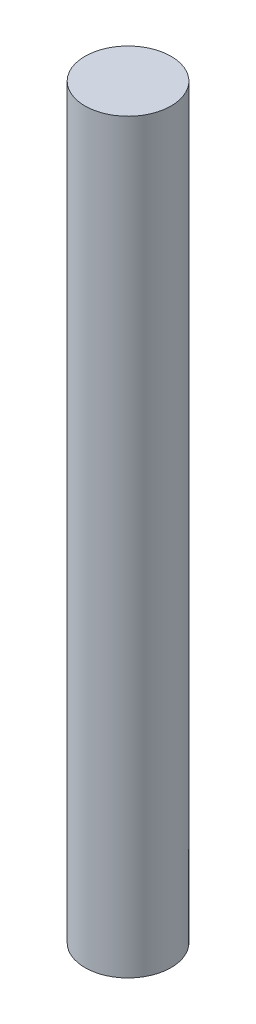
ISO-10303-21;
HEADER;
FILE_DESCRIPTION(('STEP AP214'),'2;1');
FILE_NAME('part.step','',(''),(''),'','','');
FILE_SCHEMA(('AUTOMOTIVE_DESIGN { 1 0 10303 214 1 1 1 1 }'));
ENDSEC;
DATA;
#1=APPLICATION_CONTEXT('core data for automotive mechanical design processes');
#2=APPLICATION_PROTOCOL_DEFINITION('international standard','automotive_design',2000,#1);
#3=PRODUCT_CONTEXT('',#1,'mechanical');
#4=PRODUCT('Part','Part','',(#3));
#5=PRODUCT_RELATED_PRODUCT_CATEGORY('part','',(#4));
#6=PRODUCT_DEFINITION_FORMATION('','',#4);
#7=PRODUCT_DEFINITION_CONTEXT('part definition',#1,'design');
#8=PRODUCT_DEFINITION('design','',#6,#7);
#9=PRODUCT_DEFINITION_SHAPE('','',#8);
#10=(LENGTH_UNIT() NAMED_UNIT(*) SI_UNIT(.MILLI.,.METRE.));
#11=(NAMED_UNIT(*) PLANE_ANGLE_UNIT() SI_UNIT($,.RADIAN.));
#12=(NAMED_UNIT(*) SI_UNIT($,.STERADIAN.) SOLID_ANGLE_UNIT());
#13=UNCERTAINTY_MEASURE_WITH_UNIT(LENGTH_MEASURE(1.E-05),#10,'distance_accuracy_value','');
#14=(GEOMETRIC_REPRESENTATION_CONTEXT(3) GLOBAL_UNCERTAINTY_ASSIGNED_CONTEXT((#13)) GLOBAL_UNIT_ASSIGNED_CONTEXT((#10,
#11,#12)) REPRESENTATION_CONTEXT('',''));
#15=CARTESIAN_POINT('',(0.,0.,0.));
#16=DIRECTION('',(0.,0.,1.));
#17=DIRECTION('',(1.,0.,0.));
#18=AXIS2_PLACEMENT_3D('',#15,#16,#17);
#19=CARTESIAN_POINT('',(0.,52.,0.));
#20=DIRECTION('',(0.,-1.,0.));
#21=DIRECTION('',(0.,0.,-1.));
#22=AXIS2_PLACEMENT_3D('',#19,#20,#21);
#23=CYLINDRICAL_SURFACE('',#22,3.);
#24=CARTESIAN_POINT('',(0.,52.,0.));
#25=DIRECTION('',(0.,1.,0.));
#26=DIRECTION('',(0.,0.,1.));
#27=AXIS2_PLACEMENT_3D('',#24,#25,#26);
#28=CIRCLE('',#27,3.);
#29=CARTESIAN_POINT('',(0.,52.,-3.));
#30=VERTEX_POINT('',#29);
#31=EDGE_CURVE('E10',#30,#30,#28,.T.);
#32=CARTESIAN_POINT('',(0.,0.,0.));
#33=DIRECTION('',(0.,1.,0.));
#34=DIRECTION('',(0.,0.,1.));
#35=AXIS2_PLACEMENT_3D('',#32,#33,#34);
#36=CIRCLE('',#35,3.);
#37=CARTESIAN_POINT('',(0.,0.,-3.));
#38=VERTEX_POINT('',#37);
#39=EDGE_CURVE('E42',#38,#38,#36,.T.);
#40=CARTESIAN_POINT('',(0.,52.,-3.));
#41=CARTESIAN_POINT('',(0.,51.4583333333333,-3.));
#42=CARTESIAN_POINT('',(0.,50.9166666666667,-3.));
#43=CARTESIAN_POINT('',(0.,49.8333333333333,-3.));
#44=CARTESIAN_POINT('',(0.,49.2916666666667,-3.));
#45=CARTESIAN_POINT('',(0.,48.2083333333333,-3.));
#46=CARTESIAN_POINT('',(0.,47.6666666666667,-3.));
#47=CARTESIAN_POINT('',(0.,46.5833333333333,-3.));
#48=CARTESIAN_POINT('',(0.,46.0416666666667,-3.));
#49=CARTESIAN_POINT('',(0.,44.9583333333333,-3.));
#50=CARTESIAN_POINT('',(0.,44.4166666666667,-3.));
#51=CARTESIAN_POINT('',(0.,43.3333333333333,-3.));
#52=CARTESIAN_POINT('',(0.,42.7916666666667,-3.));
#53=CARTESIAN_POINT('',(0.,41.7083333333333,-3.));
#54=CARTESIAN_POINT('',(0.,41.1666666666667,-3.));
#55=CARTESIAN_POINT('',(0.,40.0833333333333,-3.));
#56=CARTESIAN_POINT('',(0.,39.5416666666667,-3.));
#57=CARTESIAN_POINT('',(0.,38.4583333333333,-3.));
#58=CARTESIAN_POINT('',(0.,37.9166666666667,-3.));
#59=CARTESIAN_POINT('',(0.,36.8333333333333,-3.));
#60=CARTESIAN_POINT('',(0.,36.2916666666667,-3.));
#61=CARTESIAN_POINT('',(0.,35.2083333333333,-3.));
#62=CARTESIAN_POINT('',(0.,34.6666666666667,-3.));
#63=CARTESIAN_POINT('',(0.,33.5833333333333,-3.));
#64=CARTESIAN_POINT('',(0.,33.0416666666667,-3.));
#65=CARTESIAN_POINT('',(0.,31.9583333333333,-3.));
#66=CARTESIAN_POINT('',(0.,31.4166666666667,-3.));
#67=CARTESIAN_POINT('',(0.,30.3333333333333,-3.));
#68=CARTESIAN_POINT('',(0.,29.7916666666667,-3.));
#69=CARTESIAN_POINT('',(0.,28.7083333333333,-3.));
#70=CARTESIAN_POINT('',(0.,28.1666666666667,-3.));
#71=CARTESIAN_POINT('',(0.,27.0833333333333,-3.));
#72=CARTESIAN_POINT('',(0.,26.5416666666667,-3.));
#73=CARTESIAN_POINT('',(0.,25.4583333333333,-3.));
#74=CARTESIAN_POINT('',(0.,24.9166666666667,-3.));
#75=CARTESIAN_POINT('',(0.,23.8333333333333,-3.));
#76=CARTESIAN_POINT('',(0.,23.2916666666667,-3.));
#77=CARTESIAN_POINT('',(0.,22.2083333333333,-3.));
#78=CARTESIAN_POINT('',(0.,21.6666666666667,-3.));
#79=CARTESIAN_POINT('',(0.,20.5833333333333,-3.));
#80=CARTESIAN_POINT('',(0.,20.0416666666667,-3.));
#81=CARTESIAN_POINT('',(0.,18.9583333333333,-3.));
#82=CARTESIAN_POINT('',(0.,18.4166666666667,-3.));
#83=CARTESIAN_POINT('',(0.,17.3333333333333,-3.));
#84=CARTESIAN_POINT('',(0.,16.7916666666667,-3.));
#85=CARTESIAN_POINT('',(0.,15.7083333333333,-3.));
#86=CARTESIAN_POINT('',(0.,15.1666666666667,-3.));
#87=CARTESIAN_POINT('',(0.,14.0833333333333,-3.));
#88=CARTESIAN_POINT('',(0.,13.5416666666667,-3.));
#89=CARTESIAN_POINT('',(0.,12.4583333333333,-3.));
#90=CARTESIAN_POINT('',(0.,11.9166666666667,-3.));
#91=CARTESIAN_POINT('',(0.,10.8333333333333,-3.));
#92=CARTESIAN_POINT('',(0.,10.2916666666667,-3.));
#93=CARTESIAN_POINT('',(0.,9.20833333333333,-3.));
#94=CARTESIAN_POINT('',(0.,8.66666666666667,-3.));
#95=CARTESIAN_POINT('',(0.,7.58333333333333,-3.));
#96=CARTESIAN_POINT('',(0.,7.04166666666667,-3.));
#97=CARTESIAN_POINT('',(0.,5.95833333333333,-3.));
#98=CARTESIAN_POINT('',(0.,5.41666666666667,-3.));
#99=CARTESIAN_POINT('',(0.,4.33333333333333,-3.));
#100=CARTESIAN_POINT('',(0.,3.79166666666667,-3.));
#101=CARTESIAN_POINT('',(0.,2.70833333333334,-3.));
#102=CARTESIAN_POINT('',(0.,2.16666666666667,-3.));
#103=CARTESIAN_POINT('',(0.,1.08333333333333,-3.));
#104=CARTESIAN_POINT('',(0.,0.541666666666667,-3.));
#105=CARTESIAN_POINT('',(0.,0.,-3.));
#106=B_SPLINE_CURVE_WITH_KNOTS('',3,(#40,#41,#42,#43,#44,#45,#46,#47,#48,#49,#50,#51,#52,#53,
#54,#55,#56,#57,#58,#59,#60,#61,#62,#63,#64,#65,#66,#67,#68,#69,#70,#71,#72,#73,#74,#75,#76,#77,
#78,#79,#80,#81,#82,#83,#84,#85,#86,#87,#88,#89,#90,#91,#92,#93,#94,#95,#96,#97,#98,#99,#100,
#101,#102,#103,#104,#105),.UNSPECIFIED.,.F.,.F.,(4,2,2,2,2,2,2,2,2,2,2,2,2,2,2,2,2,2,2,2,2,2,2,
2,2,2,2,2,2,2,2,2,4),(0.,1.625,3.25,4.875,6.50000000000001,8.125,9.75,11.375,13.,14.625,16.25,
17.875,19.5,21.125,22.75,24.375,26.,27.625,29.25,30.875,32.5,34.125,35.75,37.375,39.,40.625,
42.25,43.875,45.5,47.125,48.75,50.375,52.),.UNSPECIFIED.);
#107=EDGE_CURVE('BSEAM39',#30,#38,#106,.T.);
#108=ORIENTED_EDGE('',*,*,#31,.F.);
#109=ORIENTED_EDGE('',*,*,#39,.T.);
#110=ORIENTED_EDGE('',*,*,#107,.T.);
#111=ORIENTED_EDGE('',*,*,#107,.F.);
#112=EDGE_LOOP('',(#108,#110,#109,#111));
#113=FACE_BOUND('',#112,.T.);
#114=ADVANCED_FACE('F39',(#113),#23,.T.);
#115=CARTESIAN_POINT('',(0.,52.,0.));
#116=DIRECTION('',(0.,1.,0.));
#117=DIRECTION('',(0.,0.,1.));
#118=AXIS2_PLACEMENT_3D('',#115,#116,#117);
#119=PLANE('',#118);
#120=ORIENTED_EDGE('',*,*,#31,.T.);
#121=EDGE_LOOP('',(#120));
#122=FACE_BOUND('',#121,.T.);
#123=ADVANCED_FACE('F54',(#122),#119,.T.);
#124=CARTESIAN_POINT('',(0.,0.,0.));
#125=DIRECTION('',(0.,1.,0.));
#126=DIRECTION('',(0.,0.,1.));
#127=AXIS2_PLACEMENT_3D('',#124,#125,#126);
#128=PLANE('',#127);
#129=ORIENTED_EDGE('',*,*,#39,.F.);
#130=EDGE_LOOP('',(#129));
#131=FACE_BOUND('',#130,.T.);
#132=ADVANCED_FACE('F52',(#131),#128,.F.);
#133=CLOSED_SHELL('',(#114,#123,#132));
#134=MANIFOLD_SOLID_BREP('B2',#133);
#135=ADVANCED_BREP_SHAPE_REPRESENTATION('',(#18,#134),#14);
#136=SHAPE_DEFINITION_REPRESENTATION(#9,#135);
ENDSEC;
END-ISO-10303-21;
